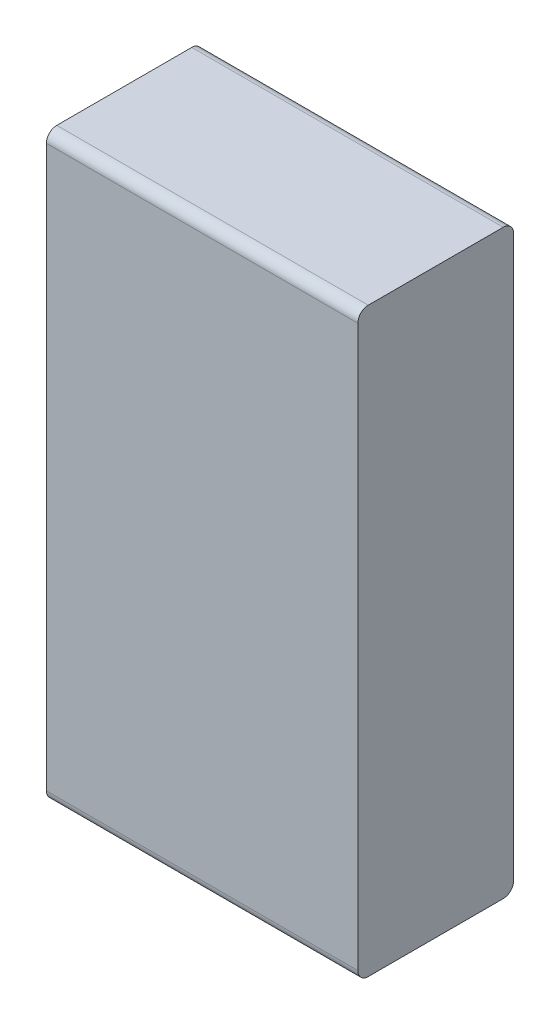
ISO-10303-21;
HEADER;
FILE_DESCRIPTION(('STEP AP214'),'2;1');
FILE_NAME('part.step','',(''),(''),'','','');
FILE_SCHEMA(('AUTOMOTIVE_DESIGN { 1 0 10303 214 1 1 1 1 }'));
ENDSEC;
DATA;
#1=APPLICATION_CONTEXT('core data for automotive mechanical design processes');
#2=APPLICATION_PROTOCOL_DEFINITION('international standard','automotive_design',2000,#1);
#3=PRODUCT_CONTEXT('',#1,'mechanical');
#4=PRODUCT('Part','Part','',(#3));
#5=PRODUCT_RELATED_PRODUCT_CATEGORY('part','',(#4));
#6=PRODUCT_DEFINITION_FORMATION('','',#4);
#7=PRODUCT_DEFINITION_CONTEXT('part definition',#1,'design');
#8=PRODUCT_DEFINITION('design','',#6,#7);
#9=PRODUCT_DEFINITION_SHAPE('','',#8);
#10=(LENGTH_UNIT() NAMED_UNIT(*) SI_UNIT(.MILLI.,.METRE.));
#11=(NAMED_UNIT(*) PLANE_ANGLE_UNIT() SI_UNIT($,.RADIAN.));
#12=(NAMED_UNIT(*) SI_UNIT($,.STERADIAN.) SOLID_ANGLE_UNIT());
#13=UNCERTAINTY_MEASURE_WITH_UNIT(LENGTH_MEASURE(1.E-05),#10,'distance_accuracy_value','');
#14=(GEOMETRIC_REPRESENTATION_CONTEXT(3) GLOBAL_UNCERTAINTY_ASSIGNED_CONTEXT((#13)) GLOBAL_UNIT_ASSIGNED_CONTEXT((#10,
#11,#12)) REPRESENTATION_CONTEXT('',''));
#15=CARTESIAN_POINT('',(0.,0.,0.));
#16=DIRECTION('',(0.,0.,1.));
#17=DIRECTION('',(1.,0.,0.));
#18=AXIS2_PLACEMENT_3D('',#15,#16,#17);
#19=CARTESIAN_POINT('',(0.15,-0.28,0.));
#20=DIRECTION('',(-1.,0.,0.));
#21=DIRECTION('',(0.,0.,1.));
#22=AXIS2_PLACEMENT_3D('',#19,#20,#21);
#23=PLANE('',#22);
#24=DIRECTION('',(0.,0.,1.));
#25=VECTOR('',#24,1.);
#26=CARTESIAN_POINT('',(0.15,-0.28,0.));
#27=LINE('',#26,#25);
#28=CARTESIAN_POINT('',(0.15,-0.28,0.01));
#29=VERTEX_POINT('',#28);
#30=CARTESIAN_POINT('',(0.15,-0.28,0.14));
#31=VERTEX_POINT('',#30);
#32=EDGE_CURVE('E11',#29,#31,#27,.T.);
#33=ORIENTED_EDGE('',*,*,#32,.F.);
#34=CARTESIAN_POINT('',(0.15,-0.27,0.01));
#35=DIRECTION('',(1.,0.,0.));
#36=DIRECTION('',(0.,0.,1.));
#37=AXIS2_PLACEMENT_3D('',#34,#35,#36);
#38=CIRCLE('',#37,0.01);
#39=CARTESIAN_POINT('',(0.15,-0.27,0.));
#40=VERTEX_POINT('',#39);
#41=EDGE_CURVE('E191',#29,#40,#38,.T.);
#42=ORIENTED_EDGE('',*,*,#41,.T.);
#43=DIRECTION('',(0.,1.,0.));
#44=VECTOR('',#43,1.);
#45=CARTESIAN_POINT('',(0.15,-0.28,0.));
#46=LINE('',#45,#44);
#47=CARTESIAN_POINT('',(0.15,0.27,0.));
#48=VERTEX_POINT('',#47);
#49=EDGE_CURVE('E75',#40,#48,#46,.T.);
#50=ORIENTED_EDGE('',*,*,#49,.T.);
#51=CARTESIAN_POINT('',(0.15,0.27,0.01));
#52=DIRECTION('',(-1.,0.,0.));
#53=DIRECTION('',(0.,0.,-1.));
#54=AXIS2_PLACEMENT_3D('',#51,#52,#53);
#55=CIRCLE('',#54,0.01);
#56=CARTESIAN_POINT('',(0.15,0.28,0.01));
#57=VERTEX_POINT('',#56);
#58=EDGE_CURVE('E113',#57,#48,#55,.T.);
#59=ORIENTED_EDGE('',*,*,#58,.F.);
#60=DIRECTION('',(0.,0.,1.));
#61=VECTOR('',#60,1.);
#62=CARTESIAN_POINT('',(0.15,0.28,0.));
#63=LINE('',#62,#61);
#64=CARTESIAN_POINT('',(0.15,0.28,0.14));
#65=VERTEX_POINT('',#64);
#66=EDGE_CURVE('E150',#57,#65,#63,.T.);
#67=ORIENTED_EDGE('',*,*,#66,.T.);
#68=CARTESIAN_POINT('',(0.15,0.27,0.14));
#69=DIRECTION('',(1.,0.,0.));
#70=DIRECTION('',(0.,0.,-1.));
#71=AXIS2_PLACEMENT_3D('',#68,#69,#70);
#72=CIRCLE('',#71,0.01);
#73=CARTESIAN_POINT('',(0.15,0.27,0.15));
#74=VERTEX_POINT('',#73);
#75=EDGE_CURVE('E116',#65,#74,#72,.T.);
#76=ORIENTED_EDGE('',*,*,#75,.T.);
#77=DIRECTION('',(0.,1.,0.));
#78=VECTOR('',#77,1.);
#79=CARTESIAN_POINT('',(0.15,-0.28,0.15));
#80=LINE('',#79,#78);
#81=CARTESIAN_POINT('',(0.15,-0.27,0.15));
#82=VERTEX_POINT('',#81);
#83=EDGE_CURVE('E86',#82,#74,#80,.T.);
#84=ORIENTED_EDGE('',*,*,#83,.F.);
#85=CARTESIAN_POINT('',(0.15,-0.27,0.14));
#86=DIRECTION('',(-1.,0.,0.));
#87=DIRECTION('',(0.,0.,1.));
#88=AXIS2_PLACEMENT_3D('',#85,#86,#87);
#89=CIRCLE('',#88,0.01);
#90=EDGE_CURVE('E26',#31,#82,#89,.T.);
#91=ORIENTED_EDGE('',*,*,#90,.F.);
#92=EDGE_LOOP('',(#33,#42,#50,#59,#67,#76,#84,#91));
#93=FACE_BOUND('',#92,.T.);
#94=ADVANCED_FACE('F17',(#93),#23,.F.);
#95=CARTESIAN_POINT('',(-0.15,-0.28,0.));
#96=DIRECTION('',(0.,1.,0.));
#97=DIRECTION('',(1.,0.,0.));
#98=AXIS2_PLACEMENT_3D('',#95,#96,#97);
#99=PLANE('',#98);
#100=DIRECTION('',(0.,0.,1.));
#101=VECTOR('',#100,1.);
#102=CARTESIAN_POINT('',(-0.15,-0.28,0.));
#103=LINE('',#102,#101);
#104=CARTESIAN_POINT('',(-0.15,-0.28,0.01));
#105=VERTEX_POINT('',#104);
#106=CARTESIAN_POINT('',(-0.15,-0.28,0.14));
#107=VERTEX_POINT('',#106);
#108=EDGE_CURVE('E141',#105,#107,#103,.T.);
#109=ORIENTED_EDGE('',*,*,#108,.F.);
#110=DIRECTION('',(1.,0.,0.));
#111=VECTOR('',#110,1.);
#112=CARTESIAN_POINT('',(-0.15,-0.28,0.01));
#113=LINE('',#112,#111);
#114=EDGE_CURVE('E171',#105,#29,#113,.T.);
#115=ORIENTED_EDGE('',*,*,#114,.T.);
#116=ORIENTED_EDGE('',*,*,#32,.T.);
#117=DIRECTION('',(1.,0.,0.));
#118=VECTOR('',#117,1.);
#119=CARTESIAN_POINT('',(-0.15,-0.28,0.14));
#120=LINE('',#119,#118);
#121=EDGE_CURVE('E167',#107,#31,#120,.T.);
#122=ORIENTED_EDGE('',*,*,#121,.F.);
#123=EDGE_LOOP('',(#109,#115,#116,#122));
#124=FACE_BOUND('',#123,.T.);
#125=ADVANCED_FACE('F198',(#124),#99,.F.);
#126=CARTESIAN_POINT('',(-0.15,-0.27,0.14));
#127=DIRECTION('',(1.,0.,0.));
#128=DIRECTION('',(0.,-1.,0.));
#129=AXIS2_PLACEMENT_3D('',#126,#127,#128);
#130=CYLINDRICAL_SURFACE('',#129,0.01);
#131=CARTESIAN_POINT('',(-0.15,-0.27,0.14));
#132=DIRECTION('',(-1.,0.,0.));
#133=DIRECTION('',(0.,0.,1.));
#134=AXIS2_PLACEMENT_3D('',#131,#132,#133);
#135=CIRCLE('',#134,0.01);
#136=CARTESIAN_POINT('',(-0.15,-0.27,0.15));
#137=VERTEX_POINT('',#136);
#138=EDGE_CURVE('E145',#107,#137,#135,.T.);
#139=ORIENTED_EDGE('',*,*,#138,.F.);
#140=ORIENTED_EDGE('',*,*,#121,.T.);
#141=ORIENTED_EDGE('',*,*,#90,.T.);
#142=DIRECTION('',(1.,0.,0.));
#143=VECTOR('',#142,1.);
#144=CARTESIAN_POINT('',(-0.15,-0.27,0.15));
#145=LINE('',#144,#143);
#146=EDGE_CURVE('E186',#137,#82,#145,.T.);
#147=ORIENTED_EDGE('',*,*,#146,.F.);
#148=EDGE_LOOP('',(#139,#140,#141,#147));
#149=FACE_BOUND('',#148,.T.);
#150=ADVANCED_FACE('F203',(#149),#130,.T.);
#151=CARTESIAN_POINT('',(-0.15,-0.27,0.01));
#152=DIRECTION('',(1.,0.,0.));
#153=DIRECTION('',(0.,-1.,0.));
#154=AXIS2_PLACEMENT_3D('',#151,#152,#153);
#155=CYLINDRICAL_SURFACE('',#154,0.01);
#156=CARTESIAN_POINT('',(-0.15,-0.27,0.01));
#157=DIRECTION('',(1.,0.,0.));
#158=DIRECTION('',(0.,0.,1.));
#159=AXIS2_PLACEMENT_3D('',#156,#157,#158);
#160=CIRCLE('',#159,0.01);
#161=CARTESIAN_POINT('',(-0.15,-0.27,0.));
#162=VERTEX_POINT('',#161);
#163=EDGE_CURVE('E127',#105,#162,#160,.T.);
#164=ORIENTED_EDGE('',*,*,#163,.T.);
#165=DIRECTION('',(1.,0.,0.));
#166=VECTOR('',#165,1.);
#167=CARTESIAN_POINT('',(-0.15,-0.27,0.));
#168=LINE('',#167,#166);
#169=EDGE_CURVE('E122',#162,#40,#168,.T.);
#170=ORIENTED_EDGE('',*,*,#169,.T.);
#171=ORIENTED_EDGE('',*,*,#41,.F.);
#172=ORIENTED_EDGE('',*,*,#114,.F.);
#173=EDGE_LOOP('',(#164,#170,#171,#172));
#174=FACE_BOUND('',#173,.T.);
#175=ADVANCED_FACE('F200',(#174),#155,.T.);
#176=CARTESIAN_POINT('',(0.,0.,0.15));
#177=DIRECTION('',(0.,0.,1.));
#178=DIRECTION('',(1.,0.,0.));
#179=AXIS2_PLACEMENT_3D('',#176,#177,#178);
#180=PLANE('',#179);
#181=DIRECTION('',(0.,-1.,0.));
#182=VECTOR('',#181,1.);
#183=CARTESIAN_POINT('',(-0.15,0.28,0.15));
#184=LINE('',#183,#182);
#185=CARTESIAN_POINT('',(-0.15,0.27,0.15));
#186=VERTEX_POINT('',#185);
#187=EDGE_CURVE('E154',#186,#137,#184,.T.);
#188=ORIENTED_EDGE('',*,*,#187,.T.);
#189=ORIENTED_EDGE('',*,*,#146,.T.);
#190=ORIENTED_EDGE('',*,*,#83,.T.);
#191=DIRECTION('',(-1.,0.,0.));
#192=VECTOR('',#191,1.);
#193=CARTESIAN_POINT('',(0.15,0.27,0.15));
#194=LINE('',#193,#192);
#195=EDGE_CURVE('E157',#74,#186,#194,.T.);
#196=ORIENTED_EDGE('',*,*,#195,.T.);
#197=EDGE_LOOP('',(#188,#189,#190,#196));
#198=FACE_BOUND('',#197,.T.);
#199=ADVANCED_FACE('F208',(#198),#180,.T.);
#200=CARTESIAN_POINT('',(0.,0.,0.));
#201=DIRECTION('',(0.,0.,1.));
#202=DIRECTION('',(1.,0.,0.));
#203=AXIS2_PLACEMENT_3D('',#200,#201,#202);
#204=PLANE('',#203);
#205=DIRECTION('',(0.,-1.,0.));
#206=VECTOR('',#205,1.);
#207=CARTESIAN_POINT('',(-0.15,0.28,0.));
#208=LINE('',#207,#206);
#209=CARTESIAN_POINT('',(-0.15,0.27,0.));
#210=VERTEX_POINT('',#209);
#211=EDGE_CURVE('E119',#210,#162,#208,.T.);
#212=ORIENTED_EDGE('',*,*,#211,.F.);
#213=DIRECTION('',(-1.,0.,0.));
#214=VECTOR('',#213,1.);
#215=CARTESIAN_POINT('',(0.15,0.27,0.));
#216=LINE('',#215,#214);
#217=EDGE_CURVE('E106',#48,#210,#216,.T.);
#218=ORIENTED_EDGE('',*,*,#217,.F.);
#219=ORIENTED_EDGE('',*,*,#49,.F.);
#220=ORIENTED_EDGE('',*,*,#169,.F.);
#221=EDGE_LOOP('',(#212,#218,#219,#220));
#222=FACE_BOUND('',#221,.T.);
#223=ADVANCED_FACE('F120',(#222),#204,.F.);
#224=CARTESIAN_POINT('',(0.15,0.27,0.14));
#225=DIRECTION('',(-1.,0.,0.));
#226=DIRECTION('',(0.,1.,0.));
#227=AXIS2_PLACEMENT_3D('',#224,#225,#226);
#228=CYLINDRICAL_SURFACE('',#227,0.01);
#229=ORIENTED_EDGE('',*,*,#75,.F.);
#230=DIRECTION('',(-1.,0.,0.));
#231=VECTOR('',#230,1.);
#232=CARTESIAN_POINT('',(0.15,0.28,0.14));
#233=LINE('',#232,#231);
#234=CARTESIAN_POINT('',(-0.15,0.28,0.14));
#235=VERTEX_POINT('',#234);
#236=EDGE_CURVE('E149',#65,#235,#233,.T.);
#237=ORIENTED_EDGE('',*,*,#236,.T.);
#238=CARTESIAN_POINT('',(-0.15,0.27,0.14));
#239=DIRECTION('',(1.,0.,0.));
#240=DIRECTION('',(0.,0.,-1.));
#241=AXIS2_PLACEMENT_3D('',#238,#239,#240);
#242=CIRCLE('',#241,0.01);
#243=EDGE_CURVE('E161',#235,#186,#242,.T.);
#244=ORIENTED_EDGE('',*,*,#243,.T.);
#245=ORIENTED_EDGE('',*,*,#195,.F.);
#246=EDGE_LOOP('',(#229,#237,#244,#245));
#247=FACE_BOUND('',#246,.T.);
#248=ADVANCED_FACE('F210',(#247),#228,.T.);
#249=CARTESIAN_POINT('',(0.15,0.27,0.01));
#250=DIRECTION('',(-1.,0.,0.));
#251=DIRECTION('',(0.,1.,0.));
#252=AXIS2_PLACEMENT_3D('',#249,#250,#251);
#253=CYLINDRICAL_SURFACE('',#252,0.01);
#254=ORIENTED_EDGE('',*,*,#58,.T.);
#255=ORIENTED_EDGE('',*,*,#217,.T.);
#256=CARTESIAN_POINT('',(-0.15,0.27,0.01));
#257=DIRECTION('',(-1.,0.,0.));
#258=DIRECTION('',(0.,0.,-1.));
#259=AXIS2_PLACEMENT_3D('',#256,#257,#258);
#260=CIRCLE('',#259,0.01);
#261=CARTESIAN_POINT('',(-0.15,0.28,0.01));
#262=VERTEX_POINT('',#261);
#263=EDGE_CURVE('E111',#262,#210,#260,.T.);
#264=ORIENTED_EDGE('',*,*,#263,.F.);
#265=DIRECTION('',(-1.,0.,0.));
#266=VECTOR('',#265,1.);
#267=CARTESIAN_POINT('',(0.15,0.28,0.01));
#268=LINE('',#267,#266);
#269=EDGE_CURVE('E146',#57,#262,#268,.T.);
#270=ORIENTED_EDGE('',*,*,#269,.F.);
#271=EDGE_LOOP('',(#254,#255,#264,#270));
#272=FACE_BOUND('',#271,.T.);
#273=ADVANCED_FACE('F108',(#272),#253,.T.);
#274=CARTESIAN_POINT('',(0.15,0.28,0.));
#275=DIRECTION('',(0.,-1.,0.));
#276=DIRECTION('',(0.,0.,-1.));
#277=AXIS2_PLACEMENT_3D('',#274,#275,#276);
#278=PLANE('',#277);
#279=ORIENTED_EDGE('',*,*,#66,.F.);
#280=ORIENTED_EDGE('',*,*,#269,.T.);
#281=DIRECTION('',(0.,0.,1.));
#282=VECTOR('',#281,1.);
#283=CARTESIAN_POINT('',(-0.15,0.28,0.));
#284=LINE('',#283,#282);
#285=EDGE_CURVE('E132',#262,#235,#284,.T.);
#286=ORIENTED_EDGE('',*,*,#285,.T.);
#287=ORIENTED_EDGE('',*,*,#236,.F.);
#288=EDGE_LOOP('',(#279,#280,#286,#287));
#289=FACE_BOUND('',#288,.T.);
#290=ADVANCED_FACE('F214',(#289),#278,.F.);
#291=CARTESIAN_POINT('',(-0.15,0.28,0.));
#292=DIRECTION('',(1.,0.,0.));
#293=DIRECTION('',(0.,1.,0.));
#294=AXIS2_PLACEMENT_3D('',#291,#292,#293);
#295=PLANE('',#294);
#296=ORIENTED_EDGE('',*,*,#285,.F.);
#297=ORIENTED_EDGE('',*,*,#263,.T.);
#298=ORIENTED_EDGE('',*,*,#211,.T.);
#299=ORIENTED_EDGE('',*,*,#163,.F.);
#300=ORIENTED_EDGE('',*,*,#108,.T.);
#301=ORIENTED_EDGE('',*,*,#138,.T.);
#302=ORIENTED_EDGE('',*,*,#187,.F.);
#303=ORIENTED_EDGE('',*,*,#243,.F.);
#304=EDGE_LOOP('',(#296,#297,#298,#299,#300,#301,#302,#303));
#305=FACE_BOUND('',#304,.T.);
#306=ADVANCED_FACE('F129',(#305),#295,.F.);
#307=CLOSED_SHELL('',(#94,#125,#150,#175,#199,#223,#248,#273,#290,#306));
#308=MANIFOLD_SOLID_BREP('B1',#307);
#309=ADVANCED_BREP_SHAPE_REPRESENTATION('',(#18,#308),#14);
#310=SHAPE_DEFINITION_REPRESENTATION(#9,#309);
ENDSEC;
END-ISO-10303-21;
